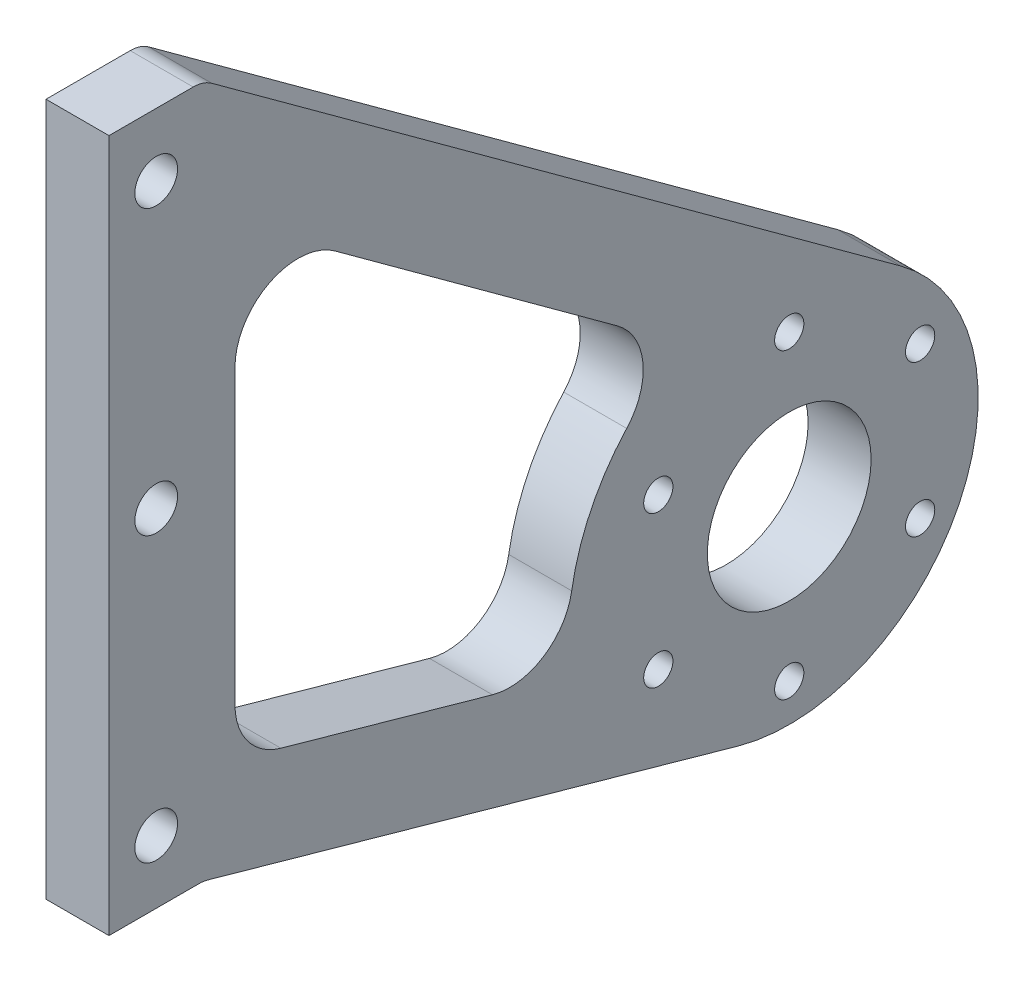
ISO-10303-21;
HEADER;
FILE_DESCRIPTION(('STEP AP214'),'2;1');
FILE_NAME('part.step','',(''),(''),'','','');
FILE_SCHEMA(('AUTOMOTIVE_DESIGN { 1 0 10303 214 1 1 1 1 }'));
ENDSEC;
DATA;
#1=APPLICATION_CONTEXT('core data for automotive mechanical design processes');
#2=APPLICATION_PROTOCOL_DEFINITION('international standard','automotive_design',2000,#1);
#3=PRODUCT_CONTEXT('',#1,'mechanical');
#4=PRODUCT('Part','Part','',(#3));
#5=PRODUCT_RELATED_PRODUCT_CATEGORY('part','',(#4));
#6=PRODUCT_DEFINITION_FORMATION('','',#4);
#7=PRODUCT_DEFINITION_CONTEXT('part definition',#1,'design');
#8=PRODUCT_DEFINITION('design','',#6,#7);
#9=PRODUCT_DEFINITION_SHAPE('','',#8);
#10=(LENGTH_UNIT() NAMED_UNIT(*) SI_UNIT(.MILLI.,.METRE.));
#11=(NAMED_UNIT(*) PLANE_ANGLE_UNIT() SI_UNIT($,.RADIAN.));
#12=(NAMED_UNIT(*) SI_UNIT($,.STERADIAN.) SOLID_ANGLE_UNIT());
#13=UNCERTAINTY_MEASURE_WITH_UNIT(LENGTH_MEASURE(1.E-05),#10,'distance_accuracy_value','');
#14=(GEOMETRIC_REPRESENTATION_CONTEXT(3) GLOBAL_UNCERTAINTY_ASSIGNED_CONTEXT((#13)) GLOBAL_UNIT_ASSIGNED_CONTEXT((#10,
#11,#12)) REPRESENTATION_CONTEXT('',''));
#15=CARTESIAN_POINT('',(0.,0.,0.));
#16=DIRECTION('',(0.,0.,1.));
#17=DIRECTION('',(1.,0.,0.));
#18=AXIS2_PLACEMENT_3D('',#15,#16,#17);
#19=CARTESIAN_POINT('',(3.175,-31.75,-68.58));
#20=DIRECTION('',(-1.,0.,0.));
#21=DIRECTION('',(0.,0.,1.));
#22=AXIS2_PLACEMENT_3D('',#19,#20,#21);
#23=PLANE('',#22);
#24=CARTESIAN_POINT('',(3.175,-31.75,-68.58));
#25=DIRECTION('',(-1.,0.,0.));
#26=DIRECTION('',(0.,0.,-1.));
#27=AXIS2_PLACEMENT_3D('',#24,#25,#26);
#28=CIRCLE('',#27,22.225);
#29=CARTESIAN_POINT('',(3.175,-28.1453096249901,-46.6492719614621));
#30=VERTEX_POINT('',#29);
#31=CARTESIAN_POINT('',(3.175,-16.7356840948091,-52.1933913545502));
#32=VERTEX_POINT('',#31);
#33=EDGE_CURVE('E254',#30,#32,#28,.T.);
#34=ORIENTED_EDGE('',*,*,#33,.F.);
#35=CARTESIAN_POINT('',(3.175,-27.115398089273,-40.383349664737));
#36=DIRECTION('',(-1.,0.,0.));
#37=DIRECTION('',(0.,0.,1.));
#38=AXIS2_PLACEMENT_3D('',#35,#36,#37);
#39=CIRCLE('',#38,6.35);
#40=CARTESIAN_POINT('',(3.175,-33.2280871173973,-38.6636017630233));
#41=VERTEX_POINT('',#40);
#42=EDGE_CURVE('E41',#30,#41,#39,.T.);
#43=ORIENTED_EDGE('',*,*,#42,.T.);
#44=DIRECTION('',(0.,-0.270826441214763,-0.962628193405401));
#45=VECTOR('',#44,1.);
#46=CARTESIAN_POINT('',(3.175,-35.4807131714756,-46.6703581902356));
#47=LINE('',#46,#45);
#48=CARTESIAN_POINT('',(3.175,-27.226148665489,-17.3302520982862));
#49=VERTEX_POINT('',#48);
#50=EDGE_CURVE('E253',#49,#41,#47,.T.);
#51=ORIENTED_EDGE('',*,*,#50,.F.);
#52=CARTESIAN_POINT('',(3.175,-21.1134596373647,-19.05));
#53=DIRECTION('',(-1.,0.,0.));
#54=DIRECTION('',(0.,0.,1.));
#55=AXIS2_PLACEMENT_3D('',#52,#53,#54);
#56=CIRCLE('',#55,6.35);
#57=CARTESIAN_POINT('',(3.175,-21.1134596373647,-12.7));
#58=VERTEX_POINT('',#57);
#59=EDGE_CURVE('E237',#49,#58,#56,.T.);
#60=ORIENTED_EDGE('',*,*,#59,.T.);
#61=DIRECTION('',(0.,-1.,0.));
#62=VECTOR('',#61,1.);
#63=CARTESIAN_POINT('',(3.175,-25.9234705325435,-12.7));
#64=LINE('',#63,#62);
#65=CARTESIAN_POINT('',(3.175,8.3225060928137,-12.7));
#66=VERTEX_POINT('',#65);
#67=EDGE_CURVE('E272',#66,#58,#64,.T.);
#68=ORIENTED_EDGE('',*,*,#67,.F.);
#69=CARTESIAN_POINT('',(3.175,8.32250609281371,-19.05));
#70=DIRECTION('',(-1.,0.,0.));
#71=DIRECTION('',(0.,0.,1.));
#72=AXIS2_PLACEMENT_3D('',#69,#70,#71);
#73=CIRCLE('',#72,6.35);
#74=CARTESIAN_POINT('',(3.175,13.4520489281419,-22.793032233435));
#75=VERTEX_POINT('',#74);
#76=EDGE_CURVE('E241',#66,#75,#73,.T.);
#77=ORIENTED_EDGE('',*,*,#76,.T.);
#78=DIRECTION('',(0.,0.589453895029137,0.807802021311521));
#79=VECTOR('',#78,1.);
#80=CARTESIAN_POINT('',(3.175,20.8169440456283,-12.7));
#81=LINE('',#80,#79);
#82=CARTESIAN_POINT('',(3.175,-7.31633671514063,-51.254535403571));
#83=VERTEX_POINT('',#82);
#84=EDGE_CURVE('E279',#83,#75,#81,.T.);
#85=ORIENTED_EDGE('',*,*,#84,.F.);
#86=CARTESIAN_POINT('',(3.175,-12.4458795504688,-47.511503170136));
#87=DIRECTION('',(-1.,0.,0.));
#88=DIRECTION('',(0.,0.,1.));
#89=AXIS2_PLACEMENT_3D('',#86,#87,#88);
#90=CIRCLE('',#89,6.35);
#91=EDGE_CURVE('E245',#83,#32,#90,.T.);
#92=ORIENTED_EDGE('',*,*,#91,.T.);
#93=EDGE_LOOP('',(#34,#43,#51,#60,#68,#77,#85,#92));
#94=FACE_BOUND('',#93,.T.);
#95=CARTESIAN_POINT('',(3.175,-39.3699999999999,-81.7782271536749));
#96=DIRECTION('',(1.,0.,0.));
#97=DIRECTION('',(0.,0.,-1.));
#98=AXIS2_PLACEMENT_3D('',#95,#96,#97);
#99=CIRCLE('',#98,1.4732);
#100=CARTESIAN_POINT('',(3.175,-39.3699999999999,-83.2514271536749));
#101=VERTEX_POINT('',#100);
#102=EDGE_CURVE('E289',#101,#101,#99,.T.);
#103=ORIENTED_EDGE('',*,*,#102,.F.);
#104=EDGE_LOOP('',(#103));
#105=FACE_BOUND('',#104,.T.);
#106=CARTESIAN_POINT('',(3.175,-39.37,-55.3817728463252));
#107=DIRECTION('',(1.,0.,0.));
#108=DIRECTION('',(0.,0.,-1.));
#109=AXIS2_PLACEMENT_3D('',#106,#107,#108);
#110=CIRCLE('',#109,1.4732);
#111=CARTESIAN_POINT('',(3.175,-39.37,-56.8549728463252));
#112=VERTEX_POINT('',#111);
#113=EDGE_CURVE('E301',#112,#112,#110,.T.);
#114=ORIENTED_EDGE('',*,*,#113,.F.);
#115=EDGE_LOOP('',(#114));
#116=FACE_BOUND('',#115,.T.);
#117=DIRECTION('',(0.,0.589453895029137,0.807802021311521));
#118=VECTOR('',#117,1.);
#119=CARTESIAN_POINT('',(3.175,34.925,-9.52499999999999));
#120=LINE('',#119,#118);
#121=CARTESIAN_POINT('',(3.175,-16.3613714940155,-79.8090967003051));
#122=VERTEX_POINT('',#121);
#123=CARTESIAN_POINT('',(3.175,34.3147714176641,-10.3612721604353));
#124=VERTEX_POINT('',#123);
#125=EDGE_CURVE('E173',#122,#124,#120,.T.);
#126=ORIENTED_EDGE('',*,*,#125,.T.);
#127=CARTESIAN_POINT('',(3.175,31.75,-8.48975604371778));
#128=DIRECTION('',(-1.,0.,0.));
#129=DIRECTION('',(0.,0.,1.));
#130=AXIS2_PLACEMENT_3D('',#127,#128,#129);
#131=CIRCLE('',#130,3.175);
#132=CARTESIAN_POINT('',(3.175,34.925,-8.48975604371778));
#133=VERTEX_POINT('',#132);
#134=EDGE_CURVE('E209',#124,#133,#131,.F.);
#135=ORIENTED_EDGE('',*,*,#134,.T.);
#136=DIRECTION('',(0.,0.,1.));
#137=VECTOR('',#136,1.);
#138=CARTESIAN_POINT('',(3.175,34.925,0.));
#139=LINE('',#138,#137);
#140=CARTESIAN_POINT('',(3.175,34.925,0.));
#141=VERTEX_POINT('',#140);
#142=EDGE_CURVE('E175',#133,#141,#139,.T.);
#143=ORIENTED_EDGE('',*,*,#142,.T.);
#144=DIRECTION('',(0.,-1.,0.));
#145=VECTOR('',#144,1.);
#146=CARTESIAN_POINT('',(3.175,-34.925,0.));
#147=LINE('',#146,#145);
#148=CARTESIAN_POINT('',(3.175,-34.925,0.));
#149=VERTEX_POINT('',#148);
#150=EDGE_CURVE('E180',#141,#149,#147,.T.);
#151=ORIENTED_EDGE('',*,*,#150,.T.);
#152=DIRECTION('',(0.,0.,-1.));
#153=VECTOR('',#152,1.);
#154=CARTESIAN_POINT('',(3.175,-34.925,0.));
#155=LINE('',#154,#153);
#156=CARTESIAN_POINT('',(3.175,-34.925,-9.08687628724271));
#157=VERTEX_POINT('',#156);
#158=EDGE_CURVE('E158',#149,#157,#155,.T.);
#159=ORIENTED_EDGE('',*,*,#158,.T.);
#160=CARTESIAN_POINT('',(3.175,-38.1,-9.08687628724272));
#161=DIRECTION('',(-1.,0.,0.));
#162=DIRECTION('',(0.,0.,1.));
#163=AXIS2_PLACEMENT_3D('',#160,#161,#162);
#164=CIRCLE('',#163,3.175);
#165=CARTESIAN_POINT('',(3.175,-35.0436554859378,-9.94675023809959));
#166=VERTEX_POINT('',#165);
#167=EDGE_CURVE('E154',#157,#166,#164,.T.);
#168=ORIENTED_EDGE('',*,*,#167,.T.);
#169=DIRECTION('',(0.,-0.270826441214763,-0.962628193405401));
#170=VECTOR('',#169,1.);
#171=CARTESIAN_POINT('',(3.175,-34.925,-9.525));
#172=LINE('',#171,#170);
#173=CARTESIAN_POINT('',(3.175,-50.0880670843729,-63.4207562948588));
#174=VERTEX_POINT('',#173);
#175=EDGE_CURVE('E145',#166,#174,#172,.T.);
#176=ORIENTED_EDGE('',*,*,#175,.T.);
#177=CARTESIAN_POINT('',(3.175,-31.75,-68.58));
#178=DIRECTION('',(1.,0.,0.));
#179=DIRECTION('',(0.,0.,1.));
#180=AXIS2_PLACEMENT_3D('',#177,#178,#179);
#181=CIRCLE('',#180,19.05);
#182=EDGE_CURVE('E150',#174,#122,#181,.T.);
#183=ORIENTED_EDGE('',*,*,#182,.T.);
#184=EDGE_LOOP('',(#126,#135,#143,#151,#159,#168,#176,#183));
#185=FACE_BOUND('',#184,.T.);
#186=CARTESIAN_POINT('',(3.175,-31.75,-68.58));
#187=DIRECTION('',(1.,0.,0.));
#188=DIRECTION('',(0.,0.,-1.));
#189=AXIS2_PLACEMENT_3D('',#186,#187,#188);
#190=CIRCLE('',#189,8.255);
#191=CARTESIAN_POINT('',(3.175,-31.75,-76.835));
#192=VERTEX_POINT('',#191);
#193=EDGE_CURVE('E337',#192,#192,#190,.T.);
#194=ORIENTED_EDGE('',*,*,#193,.F.);
#195=EDGE_LOOP('',(#194));
#196=FACE_BOUND('',#195,.T.);
#197=CARTESIAN_POINT('',(3.175,-28.575,-4.7625));
#198=DIRECTION('',(1.,0.,0.));
#199=DIRECTION('',(0.,0.,-1.));
#200=AXIS2_PLACEMENT_3D('',#197,#198,#199);
#201=CIRCLE('',#200,2.15264999999999);
#202=CARTESIAN_POINT('',(3.175,-28.575,-6.91514999999999));
#203=VERTEX_POINT('',#202);
#204=EDGE_CURVE('E331',#203,#203,#201,.T.);
#205=ORIENTED_EDGE('',*,*,#204,.F.);
#206=EDGE_LOOP('',(#205));
#207=FACE_BOUND('',#206,.T.);
#208=CARTESIAN_POINT('',(3.175,28.575,-4.76249999999999));
#209=DIRECTION('',(1.,0.,0.));
#210=DIRECTION('',(0.,0.,-1.));
#211=AXIS2_PLACEMENT_3D('',#208,#209,#210);
#212=CIRCLE('',#211,2.15264999999999);
#213=CARTESIAN_POINT('',(3.175,28.575,-6.91514999999998));
#214=VERTEX_POINT('',#213);
#215=EDGE_CURVE('E325',#214,#214,#212,.T.);
#216=ORIENTED_EDGE('',*,*,#215,.F.);
#217=EDGE_LOOP('',(#216));
#218=FACE_BOUND('',#217,.T.);
#219=CARTESIAN_POINT('',(3.175,0.,-4.76249999999999));
#220=DIRECTION('',(1.,0.,0.));
#221=DIRECTION('',(0.,0.,-1.));
#222=AXIS2_PLACEMENT_3D('',#219,#220,#221);
#223=CIRCLE('',#222,2.15264999999999);
#224=CARTESIAN_POINT('',(3.175,0.,-6.91514999999997));
#225=VERTEX_POINT('',#224);
#226=EDGE_CURVE('E319',#225,#225,#223,.T.);
#227=ORIENTED_EDGE('',*,*,#226,.F.);
#228=EDGE_LOOP('',(#227));
#229=FACE_BOUND('',#228,.T.);
#230=CARTESIAN_POINT('',(3.175,-16.51,-68.58));
#231=DIRECTION('',(1.,0.,0.));
#232=DIRECTION('',(0.,0.,-1.));
#233=AXIS2_PLACEMENT_3D('',#230,#231,#232);
#234=CIRCLE('',#233,1.4732);
#235=CARTESIAN_POINT('',(3.175,-16.51,-70.0532));
#236=VERTEX_POINT('',#235);
#237=EDGE_CURVE('E313',#236,#236,#234,.T.);
#238=ORIENTED_EDGE('',*,*,#237,.F.);
#239=EDGE_LOOP('',(#238));
#240=FACE_BOUND('',#239,.T.);
#241=CARTESIAN_POINT('',(3.175,-24.13,-55.3817728463251));
#242=DIRECTION('',(1.,0.,0.));
#243=DIRECTION('',(0.,0.,-1.));
#244=AXIS2_PLACEMENT_3D('',#241,#242,#243);
#245=CIRCLE('',#244,1.4732);
#246=CARTESIAN_POINT('',(3.175,-24.13,-56.8549728463252));
#247=VERTEX_POINT('',#246);
#248=EDGE_CURVE('E307',#247,#247,#245,.T.);
#249=ORIENTED_EDGE('',*,*,#248,.F.);
#250=EDGE_LOOP('',(#249));
#251=FACE_BOUND('',#250,.T.);
#252=CARTESIAN_POINT('',(3.175,-46.99,-68.58));
#253=DIRECTION('',(1.,0.,0.));
#254=DIRECTION('',(0.,0.,-1.));
#255=AXIS2_PLACEMENT_3D('',#252,#253,#254);
#256=CIRCLE('',#255,1.4732);
#257=CARTESIAN_POINT('',(3.175,-46.99,-70.0532));
#258=VERTEX_POINT('',#257);
#259=EDGE_CURVE('E295',#258,#258,#256,.T.);
#260=ORIENTED_EDGE('',*,*,#259,.F.);
#261=EDGE_LOOP('',(#260));
#262=FACE_BOUND('',#261,.T.);
#263=CARTESIAN_POINT('',(3.175,-24.1299999999999,-81.7782271536748));
#264=DIRECTION('',(1.,0.,0.));
#265=DIRECTION('',(0.,0.,-1.));
#266=AXIS2_PLACEMENT_3D('',#263,#264,#265);
#267=CIRCLE('',#266,1.4732);
#268=CARTESIAN_POINT('',(3.175,-24.1299999999999,-83.2514271536748));
#269=VERTEX_POINT('',#268);
#270=EDGE_CURVE('E276',#269,#269,#267,.T.);
#271=ORIENTED_EDGE('',*,*,#270,.F.);
#272=EDGE_LOOP('',(#271));
#273=FACE_BOUND('',#272,.T.);
#274=ADVANCED_FACE('F33',(#94,#105,#116,#185,#196,#207,#218,#229,#240,#251,#262,#273),#23,.F.);
#275=CARTESIAN_POINT('',(3.175,-34.925,0.));
#276=DIRECTION('',(0.,1.,0.));
#277=DIRECTION('',(0.,0.,1.));
#278=AXIS2_PLACEMENT_3D('',#275,#276,#277);
#279=PLANE('',#278);
#280=DIRECTION('',(0.,0.,-1.));
#281=VECTOR('',#280,1.);
#282=CARTESIAN_POINT('',(-3.175,-34.925,0.));
#283=LINE('',#282,#281);
#284=CARTESIAN_POINT('',(-3.175,-34.925,0.));
#285=VERTEX_POINT('',#284);
#286=CARTESIAN_POINT('',(-3.175,-34.925,-9.08687628724271));
#287=VERTEX_POINT('',#286);
#288=EDGE_CURVE('E183',#285,#287,#283,.T.);
#289=ORIENTED_EDGE('',*,*,#288,.T.);
#290=DIRECTION('',(-1.,0.,0.));
#291=VECTOR('',#290,1.);
#292=CARTESIAN_POINT('',(3.175,-34.925,-9.08687628724272));
#293=LINE('',#292,#291);
#294=EDGE_CURVE('E213',#287,#157,#293,.F.);
#295=ORIENTED_EDGE('',*,*,#294,.T.);
#296=ORIENTED_EDGE('',*,*,#158,.F.);
#297=DIRECTION('',(-1.,0.,0.));
#298=VECTOR('',#297,1.);
#299=CARTESIAN_POINT('',(3.175,-34.925,0.));
#300=LINE('',#299,#298);
#301=EDGE_CURVE('E182',#149,#285,#300,.T.);
#302=ORIENTED_EDGE('',*,*,#301,.T.);
#303=EDGE_LOOP('',(#289,#295,#296,#302));
#304=FACE_BOUND('',#303,.T.);
#305=ADVANCED_FACE('F367',(#304),#279,.F.);
#306=CARTESIAN_POINT('',(3.175,-34.925,-9.525));
#307=DIRECTION('',(0.,0.962628193405401,-0.270826441214763));
#308=DIRECTION('',(0.,0.270826441214763,0.962628193405401));
#309=AXIS2_PLACEMENT_3D('',#306,#307,#308);
#310=PLANE('',#309);
#311=ORIENTED_EDGE('',*,*,#175,.F.);
#312=DIRECTION('',(-1.,0.,0.));
#313=VECTOR('',#312,1.);
#314=CARTESIAN_POINT('',(-3.175,-35.0436554859378,-9.94675023809959));
#315=LINE('',#314,#313);
#316=CARTESIAN_POINT('',(-3.175,-35.0436554859378,-9.94675023809959));
#317=VERTEX_POINT('',#316);
#318=EDGE_CURVE('E211',#166,#317,#315,.T.);
#319=ORIENTED_EDGE('',*,*,#318,.T.);
#320=DIRECTION('',(0.,-0.270826441214763,-0.962628193405401));
#321=VECTOR('',#320,1.);
#322=CARTESIAN_POINT('',(-3.175,-34.925,-9.525));
#323=LINE('',#322,#321);
#324=CARTESIAN_POINT('',(-3.175,-50.0880670843729,-63.4207562948588));
#325=VERTEX_POINT('',#324);
#326=EDGE_CURVE('E164',#317,#325,#323,.T.);
#327=ORIENTED_EDGE('',*,*,#326,.T.);
#328=DIRECTION('',(-1.,0.,0.));
#329=VECTOR('',#328,1.);
#330=CARTESIAN_POINT('',(3.175,-50.0880670843729,-63.4207562948588));
#331=LINE('',#330,#329);
#332=EDGE_CURVE('E161',#174,#325,#331,.T.);
#333=ORIENTED_EDGE('',*,*,#332,.F.);
#334=EDGE_LOOP('',(#311,#319,#327,#333));
#335=FACE_BOUND('',#334,.T.);
#336=ADVANCED_FACE('F162',(#335),#310,.F.);
#337=CARTESIAN_POINT('',(3.175,-31.75,-68.58));
#338=DIRECTION('',(-1.,0.,0.));
#339=DIRECTION('',(0.,0.,1.));
#340=AXIS2_PLACEMENT_3D('',#337,#338,#339);
#341=CYLINDRICAL_SURFACE('',#340,19.05);
#342=CARTESIAN_POINT('',(-3.175,-31.75,-68.58));
#343=DIRECTION('',(1.,0.,0.));
#344=DIRECTION('',(0.,0.,1.));
#345=AXIS2_PLACEMENT_3D('',#342,#343,#344);
#346=CIRCLE('',#345,19.05);
#347=CARTESIAN_POINT('',(-3.175,-16.3613714940155,-79.8090967003051));
#348=VERTEX_POINT('',#347);
#349=EDGE_CURVE('E188',#325,#348,#346,.T.);
#350=ORIENTED_EDGE('',*,*,#349,.T.);
#351=DIRECTION('',(-1.,0.,0.));
#352=VECTOR('',#351,1.);
#353=CARTESIAN_POINT('',(3.175,-16.3613714940155,-79.8090967003051));
#354=LINE('',#353,#352);
#355=EDGE_CURVE('E168',#122,#348,#354,.T.);
#356=ORIENTED_EDGE('',*,*,#355,.F.);
#357=ORIENTED_EDGE('',*,*,#182,.F.);
#358=ORIENTED_EDGE('',*,*,#332,.T.);
#359=EDGE_LOOP('',(#350,#356,#357,#358));
#360=FACE_BOUND('',#359,.T.);
#361=ADVANCED_FACE('F170',(#360),#341,.T.);
#362=CARTESIAN_POINT('',(3.175,34.925,-9.52499999999999));
#363=DIRECTION('',(0.,-0.807802021311521,0.589453895029137));
#364=DIRECTION('',(0.,-0.589453895029137,-0.807802021311521));
#365=AXIS2_PLACEMENT_3D('',#362,#363,#364);
#366=PLANE('',#365);
#367=DIRECTION('',(0.,0.589453895029137,0.807802021311521));
#368=VECTOR('',#367,1.);
#369=CARTESIAN_POINT('',(-3.175,34.925,-9.52499999999999));
#370=LINE('',#369,#368);
#371=CARTESIAN_POINT('',(-3.175,34.3147714176641,-10.3612721604353));
#372=VERTEX_POINT('',#371);
#373=EDGE_CURVE('E190',#348,#372,#370,.T.);
#374=ORIENTED_EDGE('',*,*,#373,.T.);
#375=DIRECTION('',(-1.,0.,0.));
#376=VECTOR('',#375,1.);
#377=CARTESIAN_POINT('',(3.175,34.3147714176641,-10.3612721604353));
#378=LINE('',#377,#376);
#379=EDGE_CURVE('E207',#372,#124,#378,.F.);
#380=ORIENTED_EDGE('',*,*,#379,.T.);
#381=ORIENTED_EDGE('',*,*,#125,.F.);
#382=ORIENTED_EDGE('',*,*,#355,.T.);
#383=EDGE_LOOP('',(#374,#380,#381,#382));
#384=FACE_BOUND('',#383,.T.);
#385=ADVANCED_FACE('F354',(#384),#366,.F.);
#386=CARTESIAN_POINT('',(3.175,34.925,0.));
#387=DIRECTION('',(0.,-1.,0.));
#388=DIRECTION('',(0.,0.,-1.));
#389=AXIS2_PLACEMENT_3D('',#386,#387,#388);
#390=PLANE('',#389);
#391=ORIENTED_EDGE('',*,*,#142,.F.);
#392=DIRECTION('',(-1.,0.,0.));
#393=VECTOR('',#392,1.);
#394=CARTESIAN_POINT('',(3.175,34.925,-8.48975604371778));
#395=LINE('',#394,#393);
#396=CARTESIAN_POINT('',(-3.175,34.925,-8.48975604371778));
#397=VERTEX_POINT('',#396);
#398=EDGE_CURVE('E167',#133,#397,#395,.T.);
#399=ORIENTED_EDGE('',*,*,#398,.T.);
#400=DIRECTION('',(0.,0.,1.));
#401=VECTOR('',#400,1.);
#402=CARTESIAN_POINT('',(-3.175,34.925,0.));
#403=LINE('',#402,#401);
#404=CARTESIAN_POINT('',(-3.175,34.925,0.));
#405=VERTEX_POINT('',#404);
#406=EDGE_CURVE('E193',#397,#405,#403,.T.);
#407=ORIENTED_EDGE('',*,*,#406,.T.);
#408=DIRECTION('',(-1.,0.,0.));
#409=VECTOR('',#408,1.);
#410=CARTESIAN_POINT('',(3.175,34.925,0.));
#411=LINE('',#410,#409);
#412=EDGE_CURVE('E199',#141,#405,#411,.T.);
#413=ORIENTED_EDGE('',*,*,#412,.F.);
#414=EDGE_LOOP('',(#391,#399,#407,#413));
#415=FACE_BOUND('',#414,.T.);
#416=ADVANCED_FACE('F362',(#415),#390,.F.);
#417=CARTESIAN_POINT('',(3.175,-34.925,0.));
#418=DIRECTION('',(0.,0.,-1.));
#419=DIRECTION('',(0.,1.,0.));
#420=AXIS2_PLACEMENT_3D('',#417,#418,#419);
#421=PLANE('',#420);
#422=DIRECTION('',(0.,-1.,0.));
#423=VECTOR('',#422,1.);
#424=CARTESIAN_POINT('',(-3.175,-34.925,0.));
#425=LINE('',#424,#423);
#426=EDGE_CURVE('E195',#405,#285,#425,.T.);
#427=ORIENTED_EDGE('',*,*,#426,.T.);
#428=ORIENTED_EDGE('',*,*,#301,.F.);
#429=ORIENTED_EDGE('',*,*,#150,.F.);
#430=ORIENTED_EDGE('',*,*,#412,.T.);
#431=EDGE_LOOP('',(#427,#428,#429,#430));
#432=FACE_BOUND('',#431,.T.);
#433=ADVANCED_FACE('F366',(#432),#421,.F.);
#434=CARTESIAN_POINT('',(-3.175,-31.75,-68.58));
#435=DIRECTION('',(-1.,0.,0.));
#436=DIRECTION('',(0.,0.,1.));
#437=AXIS2_PLACEMENT_3D('',#434,#435,#436);
#438=PLANE('',#437);
#439=DIRECTION('',(0.,-1.,0.));
#440=VECTOR('',#439,1.);
#441=CARTESIAN_POINT('',(-3.175,-25.9234705325435,-12.7));
#442=LINE('',#441,#440);
#443=CARTESIAN_POINT('',(-3.175,8.3225060928137,-12.7));
#444=VERTEX_POINT('',#443);
#445=CARTESIAN_POINT('',(-3.175,-21.1134596373647,-12.7));
#446=VERTEX_POINT('',#445);
#447=EDGE_CURVE('E270',#444,#446,#442,.T.);
#448=ORIENTED_EDGE('',*,*,#447,.T.);
#449=CARTESIAN_POINT('',(-3.175,-21.1134596373647,-19.05));
#450=DIRECTION('',(-1.,0.,0.));
#451=DIRECTION('',(0.,0.,1.));
#452=AXIS2_PLACEMENT_3D('',#449,#450,#451);
#453=CIRCLE('',#452,6.35);
#454=CARTESIAN_POINT('',(-3.175,-27.226148665489,-17.3302520982862));
#455=VERTEX_POINT('',#454);
#456=EDGE_CURVE('E239',#446,#455,#453,.F.);
#457=ORIENTED_EDGE('',*,*,#456,.T.);
#458=DIRECTION('',(0.,-0.270826441214763,-0.962628193405401));
#459=VECTOR('',#458,1.);
#460=CARTESIAN_POINT('',(-3.175,-35.4807131714756,-46.6703581902356));
#461=LINE('',#460,#459);
#462=CARTESIAN_POINT('',(-3.175,-33.2280871173973,-38.6636017630233));
#463=VERTEX_POINT('',#462);
#464=EDGE_CURVE('E267',#455,#463,#461,.T.);
#465=ORIENTED_EDGE('',*,*,#464,.T.);
#466=CARTESIAN_POINT('',(-3.175,-27.115398089273,-40.383349664737));
#467=DIRECTION('',(-1.,0.,0.));
#468=DIRECTION('',(0.,0.,1.));
#469=AXIS2_PLACEMENT_3D('',#466,#467,#468);
#470=CIRCLE('',#469,6.35);
#471=CARTESIAN_POINT('',(-3.175,-28.1453096249901,-46.6492719614621));
#472=VERTEX_POINT('',#471);
#473=EDGE_CURVE('E11',#463,#472,#470,.F.);
#474=ORIENTED_EDGE('',*,*,#473,.T.);
#475=CARTESIAN_POINT('',(-3.175,-31.75,-68.58));
#476=DIRECTION('',(-1.,0.,0.));
#477=DIRECTION('',(0.,0.,-1.));
#478=AXIS2_PLACEMENT_3D('',#475,#476,#477);
#479=CIRCLE('',#478,22.225);
#480=CARTESIAN_POINT('',(-3.175,-16.7356840948091,-52.1933913545502));
#481=VERTEX_POINT('',#480);
#482=EDGE_CURVE('E264',#472,#481,#479,.T.);
#483=ORIENTED_EDGE('',*,*,#482,.T.);
#484=CARTESIAN_POINT('',(-3.175,-12.4458795504688,-47.511503170136));
#485=DIRECTION('',(-1.,0.,0.));
#486=DIRECTION('',(0.,0.,1.));
#487=AXIS2_PLACEMENT_3D('',#484,#485,#486);
#488=CIRCLE('',#487,6.35);
#489=CARTESIAN_POINT('',(-3.175,-7.31633671514063,-51.254535403571));
#490=VERTEX_POINT('',#489);
#491=EDGE_CURVE('E247',#481,#490,#488,.F.);
#492=ORIENTED_EDGE('',*,*,#491,.T.);
#493=DIRECTION('',(0.,0.589453895029137,0.807802021311521));
#494=VECTOR('',#493,1.);
#495=CARTESIAN_POINT('',(-3.175,20.8169440456283,-12.7));
#496=LINE('',#495,#494);
#497=CARTESIAN_POINT('',(-3.175,13.4520489281419,-22.793032233435));
#498=VERTEX_POINT('',#497);
#499=EDGE_CURVE('E266',#490,#498,#496,.T.);
#500=ORIENTED_EDGE('',*,*,#499,.T.);
#501=CARTESIAN_POINT('',(-3.175,8.32250609281371,-19.05));
#502=DIRECTION('',(-1.,0.,0.));
#503=DIRECTION('',(0.,0.,1.));
#504=AXIS2_PLACEMENT_3D('',#501,#502,#503);
#505=CIRCLE('',#504,6.35);
#506=EDGE_CURVE('E243',#498,#444,#505,.F.);
#507=ORIENTED_EDGE('',*,*,#506,.T.);
#508=EDGE_LOOP('',(#448,#457,#465,#474,#483,#492,#500,#507));
#509=FACE_BOUND('',#508,.T.);
#510=CARTESIAN_POINT('',(-3.175,-24.1299999999999,-81.7782271536748));
#511=DIRECTION('',(1.,0.,0.));
#512=DIRECTION('',(0.,0.,-1.));
#513=AXIS2_PLACEMENT_3D('',#510,#511,#512);
#514=CIRCLE('',#513,1.4732);
#515=CARTESIAN_POINT('',(-3.175,-24.1299999999999,-83.2514271536748));
#516=VERTEX_POINT('',#515);
#517=EDGE_CURVE('E286',#516,#516,#514,.T.);
#518=ORIENTED_EDGE('',*,*,#517,.T.);
#519=EDGE_LOOP('',(#518));
#520=FACE_BOUND('',#519,.T.);
#521=CARTESIAN_POINT('',(-3.175,-39.3699999999999,-81.7782271536749));
#522=DIRECTION('',(1.,0.,0.));
#523=DIRECTION('',(0.,0.,-1.));
#524=AXIS2_PLACEMENT_3D('',#521,#522,#523);
#525=CIRCLE('',#524,1.4732);
#526=CARTESIAN_POINT('',(-3.175,-39.3699999999999,-83.2514271536749));
#527=VERTEX_POINT('',#526);
#528=EDGE_CURVE('E292',#527,#527,#525,.T.);
#529=ORIENTED_EDGE('',*,*,#528,.T.);
#530=EDGE_LOOP('',(#529));
#531=FACE_BOUND('',#530,.T.);
#532=CARTESIAN_POINT('',(-3.175,-46.99,-68.58));
#533=DIRECTION('',(1.,0.,0.));
#534=DIRECTION('',(0.,0.,-1.));
#535=AXIS2_PLACEMENT_3D('',#532,#533,#534);
#536=CIRCLE('',#535,1.4732);
#537=CARTESIAN_POINT('',(-3.175,-46.99,-70.0532));
#538=VERTEX_POINT('',#537);
#539=EDGE_CURVE('E298',#538,#538,#536,.T.);
#540=ORIENTED_EDGE('',*,*,#539,.T.);
#541=EDGE_LOOP('',(#540));
#542=FACE_BOUND('',#541,.T.);
#543=CARTESIAN_POINT('',(-3.175,-39.37,-55.3817728463252));
#544=DIRECTION('',(1.,0.,0.));
#545=DIRECTION('',(0.,0.,-1.));
#546=AXIS2_PLACEMENT_3D('',#543,#544,#545);
#547=CIRCLE('',#546,1.4732);
#548=CARTESIAN_POINT('',(-3.175,-39.37,-56.8549728463252));
#549=VERTEX_POINT('',#548);
#550=EDGE_CURVE('E304',#549,#549,#547,.T.);
#551=ORIENTED_EDGE('',*,*,#550,.T.);
#552=EDGE_LOOP('',(#551));
#553=FACE_BOUND('',#552,.T.);
#554=CARTESIAN_POINT('',(-3.175,-24.13,-55.3817728463251));
#555=DIRECTION('',(1.,0.,0.));
#556=DIRECTION('',(0.,0.,-1.));
#557=AXIS2_PLACEMENT_3D('',#554,#555,#556);
#558=CIRCLE('',#557,1.4732);
#559=CARTESIAN_POINT('',(-3.175,-24.13,-56.8549728463252));
#560=VERTEX_POINT('',#559);
#561=EDGE_CURVE('E310',#560,#560,#558,.T.);
#562=ORIENTED_EDGE('',*,*,#561,.T.);
#563=EDGE_LOOP('',(#562));
#564=FACE_BOUND('',#563,.T.);
#565=CARTESIAN_POINT('',(-3.175,-16.51,-68.58));
#566=DIRECTION('',(1.,0.,0.));
#567=DIRECTION('',(0.,0.,-1.));
#568=AXIS2_PLACEMENT_3D('',#565,#566,#567);
#569=CIRCLE('',#568,1.4732);
#570=CARTESIAN_POINT('',(-3.175,-16.51,-70.0532));
#571=VERTEX_POINT('',#570);
#572=EDGE_CURVE('E316',#571,#571,#569,.T.);
#573=ORIENTED_EDGE('',*,*,#572,.T.);
#574=EDGE_LOOP('',(#573));
#575=FACE_BOUND('',#574,.T.);
#576=CARTESIAN_POINT('',(-3.17499999999999,0.,-4.76249999999999));
#577=DIRECTION('',(1.,0.,0.));
#578=DIRECTION('',(0.,0.,-1.));
#579=AXIS2_PLACEMENT_3D('',#576,#577,#578);
#580=CIRCLE('',#579,2.15264999999999);
#581=CARTESIAN_POINT('',(-3.17499999999999,0.,-6.91514999999997));
#582=VERTEX_POINT('',#581);
#583=EDGE_CURVE('E322',#582,#582,#580,.T.);
#584=ORIENTED_EDGE('',*,*,#583,.T.);
#585=EDGE_LOOP('',(#584));
#586=FACE_BOUND('',#585,.T.);
#587=CARTESIAN_POINT('',(-3.17499999999999,28.575,-4.76249999999999));
#588=DIRECTION('',(1.,0.,0.));
#589=DIRECTION('',(0.,0.,-1.));
#590=AXIS2_PLACEMENT_3D('',#587,#588,#589);
#591=CIRCLE('',#590,2.15264999999999);
#592=CARTESIAN_POINT('',(-3.17499999999999,28.575,-6.91514999999998));
#593=VERTEX_POINT('',#592);
#594=EDGE_CURVE('E328',#593,#593,#591,.T.);
#595=ORIENTED_EDGE('',*,*,#594,.T.);
#596=EDGE_LOOP('',(#595));
#597=FACE_BOUND('',#596,.T.);
#598=CARTESIAN_POINT('',(-3.17499999999999,-28.575,-4.7625));
#599=DIRECTION('',(1.,0.,0.));
#600=DIRECTION('',(0.,0.,-1.));
#601=AXIS2_PLACEMENT_3D('',#598,#599,#600);
#602=CIRCLE('',#601,2.15264999999999);
#603=CARTESIAN_POINT('',(-3.17499999999999,-28.575,-6.91514999999999));
#604=VERTEX_POINT('',#603);
#605=EDGE_CURVE('E334',#604,#604,#602,.T.);
#606=ORIENTED_EDGE('',*,*,#605,.T.);
#607=EDGE_LOOP('',(#606));
#608=FACE_BOUND('',#607,.T.);
#609=CARTESIAN_POINT('',(-3.175,-31.75,-68.58));
#610=DIRECTION('',(1.,0.,0.));
#611=DIRECTION('',(0.,0.,-1.));
#612=AXIS2_PLACEMENT_3D('',#609,#610,#611);
#613=CIRCLE('',#612,8.255);
#614=CARTESIAN_POINT('',(-3.175,-31.75,-76.835));
#615=VERTEX_POINT('',#614);
#616=EDGE_CURVE('E186',#615,#615,#613,.T.);
#617=ORIENTED_EDGE('',*,*,#616,.T.);
#618=EDGE_LOOP('',(#617));
#619=FACE_BOUND('',#618,.T.);
#620=ORIENTED_EDGE('',*,*,#406,.F.);
#621=CARTESIAN_POINT('',(-3.175,31.75,-8.48975604371778));
#622=DIRECTION('',(-1.,0.,0.));
#623=DIRECTION('',(0.,0.,1.));
#624=AXIS2_PLACEMENT_3D('',#621,#622,#623);
#625=CIRCLE('',#624,3.175);
#626=EDGE_CURVE('E205',#397,#372,#625,.T.);
#627=ORIENTED_EDGE('',*,*,#626,.T.);
#628=ORIENTED_EDGE('',*,*,#373,.F.);
#629=ORIENTED_EDGE('',*,*,#349,.F.);
#630=ORIENTED_EDGE('',*,*,#326,.F.);
#631=CARTESIAN_POINT('',(-3.175,-38.1,-9.08687628724272));
#632=DIRECTION('',(-1.,0.,0.));
#633=DIRECTION('',(0.,0.,1.));
#634=AXIS2_PLACEMENT_3D('',#631,#632,#633);
#635=CIRCLE('',#634,3.175);
#636=EDGE_CURVE('E215',#317,#287,#635,.F.);
#637=ORIENTED_EDGE('',*,*,#636,.T.);
#638=ORIENTED_EDGE('',*,*,#288,.F.);
#639=ORIENTED_EDGE('',*,*,#426,.F.);
#640=EDGE_LOOP('',(#620,#627,#628,#629,#630,#637,#638,#639));
#641=FACE_BOUND('',#640,.T.);
#642=ADVANCED_FACE('F350',(#509,#520,#531,#542,#553,#564,#575,#586,#597,#608,#619,#641),#438,.T.);
#643=CARTESIAN_POINT('',(-3.175,-31.75,-68.58));
#644=DIRECTION('',(1.,0.,0.));
#645=DIRECTION('',(0.,0.,-1.));
#646=AXIS2_PLACEMENT_3D('',#643,#644,#645);
#647=CYLINDRICAL_SURFACE('',#646,8.255);
#648=ORIENTED_EDGE('',*,*,#616,.F.);
#649=EDGE_LOOP('',(#648));
#650=FACE_BOUND('',#649,.T.);
#651=ORIENTED_EDGE('',*,*,#193,.T.);
#652=EDGE_LOOP('',(#651));
#653=FACE_BOUND('',#652,.T.);
#654=ADVANCED_FACE('F456',(#650,#653),#647,.F.);
#655=CARTESIAN_POINT('',(3.175,-28.575,-4.7625));
#656=DIRECTION('',(1.,0.,0.));
#657=DIRECTION('',(0.,0.,-1.));
#658=AXIS2_PLACEMENT_3D('',#655,#656,#657);
#659=CYLINDRICAL_SURFACE('',#658,2.15264999999999);
#660=ORIENTED_EDGE('',*,*,#605,.F.);
#661=EDGE_LOOP('',(#660));
#662=FACE_BOUND('',#661,.T.);
#663=ORIENTED_EDGE('',*,*,#204,.T.);
#664=EDGE_LOOP('',(#663));
#665=FACE_BOUND('',#664,.T.);
#666=ADVANCED_FACE('F452',(#662,#665),#659,.F.);
#667=CARTESIAN_POINT('',(3.175,28.575,-4.76249999999999));
#668=DIRECTION('',(1.,0.,0.));
#669=DIRECTION('',(0.,0.,-1.));
#670=AXIS2_PLACEMENT_3D('',#667,#668,#669);
#671=CYLINDRICAL_SURFACE('',#670,2.15264999999999);
#672=ORIENTED_EDGE('',*,*,#594,.F.);
#673=EDGE_LOOP('',(#672));
#674=FACE_BOUND('',#673,.T.);
#675=ORIENTED_EDGE('',*,*,#215,.T.);
#676=EDGE_LOOP('',(#675));
#677=FACE_BOUND('',#676,.T.);
#678=ADVANCED_FACE('F448',(#674,#677),#671,.F.);
#679=CARTESIAN_POINT('',(3.175,0.,-4.76249999999999));
#680=DIRECTION('',(1.,0.,0.));
#681=DIRECTION('',(0.,0.,-1.));
#682=AXIS2_PLACEMENT_3D('',#679,#680,#681);
#683=CYLINDRICAL_SURFACE('',#682,2.15264999999999);
#684=ORIENTED_EDGE('',*,*,#583,.F.);
#685=EDGE_LOOP('',(#684));
#686=FACE_BOUND('',#685,.T.);
#687=ORIENTED_EDGE('',*,*,#226,.T.);
#688=EDGE_LOOP('',(#687));
#689=FACE_BOUND('',#688,.T.);
#690=ADVANCED_FACE('F444',(#686,#689),#683,.F.);
#691=CARTESIAN_POINT('',(3.175,-16.51,-68.58));
#692=DIRECTION('',(1.,0.,0.));
#693=DIRECTION('',(0.,0.,-1.));
#694=AXIS2_PLACEMENT_3D('',#691,#692,#693);
#695=CYLINDRICAL_SURFACE('',#694,1.4732);
#696=ORIENTED_EDGE('',*,*,#572,.F.);
#697=EDGE_LOOP('',(#696));
#698=FACE_BOUND('',#697,.T.);
#699=ORIENTED_EDGE('',*,*,#237,.T.);
#700=EDGE_LOOP('',(#699));
#701=FACE_BOUND('',#700,.T.);
#702=ADVANCED_FACE('F440',(#698,#701),#695,.F.);
#703=CARTESIAN_POINT('',(3.175,-24.13,-55.3817728463251));
#704=DIRECTION('',(1.,0.,0.));
#705=DIRECTION('',(0.,0.,-1.));
#706=AXIS2_PLACEMENT_3D('',#703,#704,#705);
#707=CYLINDRICAL_SURFACE('',#706,1.4732);
#708=ORIENTED_EDGE('',*,*,#561,.F.);
#709=EDGE_LOOP('',(#708));
#710=FACE_BOUND('',#709,.T.);
#711=ORIENTED_EDGE('',*,*,#248,.T.);
#712=EDGE_LOOP('',(#711));
#713=FACE_BOUND('',#712,.T.);
#714=ADVANCED_FACE('F436',(#710,#713),#707,.F.);
#715=CARTESIAN_POINT('',(3.175,-39.37,-55.3817728463252));
#716=DIRECTION('',(1.,0.,0.));
#717=DIRECTION('',(0.,0.,-1.));
#718=AXIS2_PLACEMENT_3D('',#715,#716,#717);
#719=CYLINDRICAL_SURFACE('',#718,1.4732);
#720=ORIENTED_EDGE('',*,*,#550,.F.);
#721=EDGE_LOOP('',(#720));
#722=FACE_BOUND('',#721,.T.);
#723=ORIENTED_EDGE('',*,*,#113,.T.);
#724=EDGE_LOOP('',(#723));
#725=FACE_BOUND('',#724,.T.);
#726=ADVANCED_FACE('F432',(#722,#725),#719,.F.);
#727=CARTESIAN_POINT('',(3.175,-46.99,-68.58));
#728=DIRECTION('',(1.,0.,0.));
#729=DIRECTION('',(0.,0.,-1.));
#730=AXIS2_PLACEMENT_3D('',#727,#728,#729);
#731=CYLINDRICAL_SURFACE('',#730,1.4732);
#732=ORIENTED_EDGE('',*,*,#539,.F.);
#733=EDGE_LOOP('',(#732));
#734=FACE_BOUND('',#733,.T.);
#735=ORIENTED_EDGE('',*,*,#259,.T.);
#736=EDGE_LOOP('',(#735));
#737=FACE_BOUND('',#736,.T.);
#738=ADVANCED_FACE('F428',(#734,#737),#731,.F.);
#739=CARTESIAN_POINT('',(3.175,-39.3699999999999,-81.7782271536749));
#740=DIRECTION('',(1.,0.,0.));
#741=DIRECTION('',(0.,0.,-1.));
#742=AXIS2_PLACEMENT_3D('',#739,#740,#741);
#743=CYLINDRICAL_SURFACE('',#742,1.4732);
#744=ORIENTED_EDGE('',*,*,#528,.F.);
#745=EDGE_LOOP('',(#744));
#746=FACE_BOUND('',#745,.T.);
#747=ORIENTED_EDGE('',*,*,#102,.T.);
#748=EDGE_LOOP('',(#747));
#749=FACE_BOUND('',#748,.T.);
#750=ADVANCED_FACE('F424',(#746,#749),#743,.F.);
#751=CARTESIAN_POINT('',(3.175,-24.1299999999999,-81.7782271536748));
#752=DIRECTION('',(1.,0.,0.));
#753=DIRECTION('',(0.,0.,-1.));
#754=AXIS2_PLACEMENT_3D('',#751,#752,#753);
#755=CYLINDRICAL_SURFACE('',#754,1.4732);
#756=ORIENTED_EDGE('',*,*,#517,.F.);
#757=EDGE_LOOP('',(#756));
#758=FACE_BOUND('',#757,.T.);
#759=ORIENTED_EDGE('',*,*,#270,.T.);
#760=EDGE_LOOP('',(#759));
#761=FACE_BOUND('',#760,.T.);
#762=ADVANCED_FACE('F380',(#758,#761),#755,.F.);
#763=CARTESIAN_POINT('',(3.175,31.75,-8.48975604371778));
#764=DIRECTION('',(-1.,0.,0.));
#765=DIRECTION('',(0.,0.,1.));
#766=AXIS2_PLACEMENT_3D('',#763,#764,#765);
#767=CYLINDRICAL_SURFACE('',#766,3.175);
#768=ORIENTED_EDGE('',*,*,#134,.F.);
#769=ORIENTED_EDGE('',*,*,#379,.F.);
#770=ORIENTED_EDGE('',*,*,#626,.F.);
#771=ORIENTED_EDGE('',*,*,#398,.F.);
#772=EDGE_LOOP('',(#768,#769,#770,#771));
#773=FACE_BOUND('',#772,.T.);
#774=ADVANCED_FACE('F360',(#773),#767,.T.);
#775=CARTESIAN_POINT('',(3.175,-38.1,-9.08687628724272));
#776=DIRECTION('',(1.,0.,0.));
#777=DIRECTION('',(0.,0.,-1.));
#778=AXIS2_PLACEMENT_3D('',#775,#776,#777);
#779=CYLINDRICAL_SURFACE('',#778,3.175);
#780=ORIENTED_EDGE('',*,*,#167,.F.);
#781=ORIENTED_EDGE('',*,*,#294,.F.);
#782=ORIENTED_EDGE('',*,*,#636,.F.);
#783=ORIENTED_EDGE('',*,*,#318,.F.);
#784=EDGE_LOOP('',(#780,#781,#782,#783));
#785=FACE_BOUND('',#784,.T.);
#786=ADVANCED_FACE('F347',(#785),#779,.F.);
#787=CARTESIAN_POINT('',(-3.175,-35.4807131714756,-46.6703581902356));
#788=DIRECTION('',(0.,-0.962628193405401,0.270826441214763));
#789=DIRECTION('',(0.,-0.270826441214763,-0.962628193405401));
#790=AXIS2_PLACEMENT_3D('',#787,#788,#789);
#791=PLANE('',#790);
#792=ORIENTED_EDGE('',*,*,#464,.F.);
#793=DIRECTION('',(1.,0.,0.));
#794=VECTOR('',#793,1.);
#795=CARTESIAN_POINT('',(3.175,-27.226148665489,-17.3302520982862));
#796=LINE('',#795,#794);
#797=EDGE_CURVE('E220',#455,#49,#796,.T.);
#798=ORIENTED_EDGE('',*,*,#797,.T.);
#799=ORIENTED_EDGE('',*,*,#50,.T.);
#800=DIRECTION('',(-1.,0.,0.));
#801=VECTOR('',#800,1.);
#802=CARTESIAN_POINT('',(-3.175,-33.2280871173973,-38.6636017630233));
#803=LINE('',#802,#801);
#804=EDGE_CURVE('E218',#41,#463,#803,.T.);
#805=ORIENTED_EDGE('',*,*,#804,.T.);
#806=EDGE_LOOP('',(#792,#798,#799,#805));
#807=FACE_BOUND('',#806,.T.);
#808=ADVANCED_FACE('F260',(#807),#791,.F.);
#809=CARTESIAN_POINT('',(-3.175,-25.9234705325435,-12.7));
#810=DIRECTION('',(0.,0.,1.));
#811=DIRECTION('',(0.,-1.,0.));
#812=AXIS2_PLACEMENT_3D('',#809,#810,#811);
#813=PLANE('',#812);
#814=ORIENTED_EDGE('',*,*,#67,.T.);
#815=DIRECTION('',(1.,0.,0.));
#816=VECTOR('',#815,1.);
#817=CARTESIAN_POINT('',(-3.175,-21.1134596373647,-12.7));
#818=LINE('',#817,#816);
#819=EDGE_CURVE('E226',#58,#446,#818,.F.);
#820=ORIENTED_EDGE('',*,*,#819,.T.);
#821=ORIENTED_EDGE('',*,*,#447,.F.);
#822=DIRECTION('',(1.,0.,0.));
#823=VECTOR('',#822,1.);
#824=CARTESIAN_POINT('',(3.175,8.32250609281371,-12.7));
#825=LINE('',#824,#823);
#826=EDGE_CURVE('E223',#444,#66,#825,.T.);
#827=ORIENTED_EDGE('',*,*,#826,.T.);
#828=EDGE_LOOP('',(#814,#820,#821,#827));
#829=FACE_BOUND('',#828,.T.);
#830=ADVANCED_FACE('F408',(#829),#813,.F.);
#831=CARTESIAN_POINT('',(-3.175,20.8169440456283,-12.7));
#832=DIRECTION('',(0.,0.807802021311521,-0.589453895029137));
#833=DIRECTION('',(0.,0.589453895029137,0.807802021311521));
#834=AXIS2_PLACEMENT_3D('',#831,#832,#833);
#835=PLANE('',#834);
#836=ORIENTED_EDGE('',*,*,#84,.T.);
#837=DIRECTION('',(1.,0.,0.));
#838=VECTOR('',#837,1.);
#839=CARTESIAN_POINT('',(-3.175,13.4520489281419,-22.793032233435));
#840=LINE('',#839,#838);
#841=EDGE_CURVE('E231',#75,#498,#840,.F.);
#842=ORIENTED_EDGE('',*,*,#841,.T.);
#843=ORIENTED_EDGE('',*,*,#499,.F.);
#844=DIRECTION('',(-1.,0.,0.));
#845=VECTOR('',#844,1.);
#846=CARTESIAN_POINT('',(3.175,-7.31633671514063,-51.254535403571));
#847=LINE('',#846,#845);
#848=EDGE_CURVE('E228',#490,#83,#847,.F.);
#849=ORIENTED_EDGE('',*,*,#848,.T.);
#850=EDGE_LOOP('',(#836,#842,#843,#849));
#851=FACE_BOUND('',#850,.T.);
#852=ADVANCED_FACE('F401',(#851),#835,.F.);
#853=CARTESIAN_POINT('',(-3.175,-31.75,-68.58));
#854=DIRECTION('',(1.,0.,0.));
#855=DIRECTION('',(0.,0.,-1.));
#856=AXIS2_PLACEMENT_3D('',#853,#854,#855);
#857=CYLINDRICAL_SURFACE('',#856,22.225);
#858=ORIENTED_EDGE('',*,*,#33,.T.);
#859=DIRECTION('',(1.,0.,0.));
#860=VECTOR('',#859,1.);
#861=CARTESIAN_POINT('',(-3.175,-16.7356840948091,-52.1933913545502));
#862=LINE('',#861,#860);
#863=EDGE_CURVE('E48',#32,#481,#862,.F.);
#864=ORIENTED_EDGE('',*,*,#863,.T.);
#865=ORIENTED_EDGE('',*,*,#482,.F.);
#866=DIRECTION('',(1.,0.,0.));
#867=VECTOR('',#866,1.);
#868=CARTESIAN_POINT('',(-3.175,-28.1453096249901,-46.6492719614621));
#869=LINE('',#868,#867);
#870=EDGE_CURVE('E233',#472,#30,#869,.T.);
#871=ORIENTED_EDGE('',*,*,#870,.T.);
#872=EDGE_LOOP('',(#858,#864,#865,#871));
#873=FACE_BOUND('',#872,.T.);
#874=ADVANCED_FACE('F263',(#873),#857,.T.);
#875=CARTESIAN_POINT('',(-3.175,-21.1134596373647,-19.05));
#876=DIRECTION('',(-1.,0.,0.));
#877=DIRECTION('',(0.,0.,1.));
#878=AXIS2_PLACEMENT_3D('',#875,#876,#877);
#879=CYLINDRICAL_SURFACE('',#878,6.35);
#880=ORIENTED_EDGE('',*,*,#456,.F.);
#881=ORIENTED_EDGE('',*,*,#819,.F.);
#882=ORIENTED_EDGE('',*,*,#59,.F.);
#883=ORIENTED_EDGE('',*,*,#797,.F.);
#884=EDGE_LOOP('',(#880,#881,#882,#883));
#885=FACE_BOUND('',#884,.T.);
#886=ADVANCED_FACE('F383',(#885),#879,.F.);
#887=CARTESIAN_POINT('',(-3.175,8.32250609281371,-19.05));
#888=DIRECTION('',(-1.,0.,0.));
#889=DIRECTION('',(0.,0.,1.));
#890=AXIS2_PLACEMENT_3D('',#887,#888,#889);
#891=CYLINDRICAL_SURFACE('',#890,6.35);
#892=ORIENTED_EDGE('',*,*,#506,.F.);
#893=ORIENTED_EDGE('',*,*,#841,.F.);
#894=ORIENTED_EDGE('',*,*,#76,.F.);
#895=ORIENTED_EDGE('',*,*,#826,.F.);
#896=EDGE_LOOP('',(#892,#893,#894,#895));
#897=FACE_BOUND('',#896,.T.);
#898=ADVANCED_FACE('F386',(#897),#891,.F.);
#899=CARTESIAN_POINT('',(-3.175,-12.4458795504688,-47.511503170136));
#900=DIRECTION('',(1.,0.,0.));
#901=DIRECTION('',(0.,0.,-1.));
#902=AXIS2_PLACEMENT_3D('',#899,#900,#901);
#903=CYLINDRICAL_SURFACE('',#902,6.35);
#904=ORIENTED_EDGE('',*,*,#491,.F.);
#905=ORIENTED_EDGE('',*,*,#863,.F.);
#906=ORIENTED_EDGE('',*,*,#91,.F.);
#907=ORIENTED_EDGE('',*,*,#848,.F.);
#908=EDGE_LOOP('',(#904,#905,#906,#907));
#909=FACE_BOUND('',#908,.T.);
#910=ADVANCED_FACE('F389',(#909),#903,.F.);
#911=CARTESIAN_POINT('',(-3.175,-27.115398089273,-40.383349664737));
#912=DIRECTION('',(1.,0.,0.));
#913=DIRECTION('',(0.,0.,-1.));
#914=AXIS2_PLACEMENT_3D('',#911,#912,#913);
#915=CYLINDRICAL_SURFACE('',#914,6.35);
#916=ORIENTED_EDGE('',*,*,#473,.F.);
#917=ORIENTED_EDGE('',*,*,#804,.F.);
#918=ORIENTED_EDGE('',*,*,#42,.F.);
#919=ORIENTED_EDGE('',*,*,#870,.F.);
#920=EDGE_LOOP('',(#916,#917,#918,#919));
#921=FACE_BOUND('',#920,.T.);
#922=ADVANCED_FACE('F35',(#921),#915,.F.);
#923=CLOSED_SHELL('',(#274,#305,#336,#361,#385,#416,#433,#642,#654,#666,#678,#690,#702,#714,
#726,#738,#750,#762,#774,#786,#808,#830,#852,#874,#886,#898,#910,#922));
#924=MANIFOLD_SOLID_BREP('B2',#923);
#925=ADVANCED_BREP_SHAPE_REPRESENTATION('',(#18,#924),#14);
#926=SHAPE_DEFINITION_REPRESENTATION(#9,#925);
ENDSEC;
END-ISO-10303-21;
